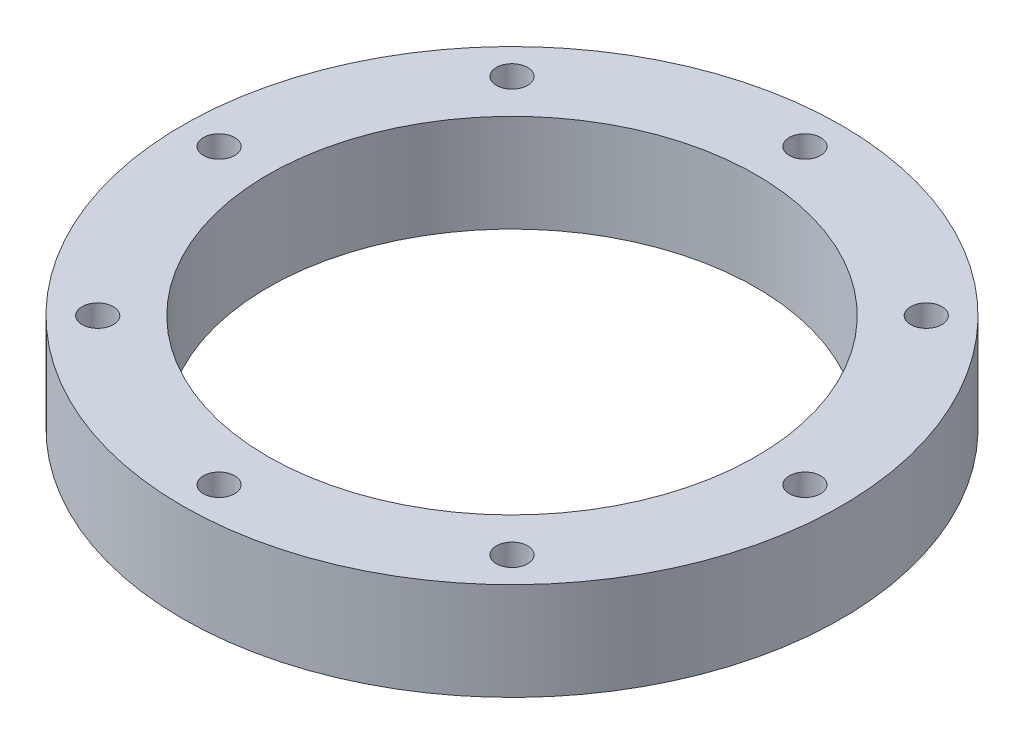
ISO-10303-21;
HEADER;
FILE_DESCRIPTION(('STEP AP214'),'2;1');
FILE_NAME('part.step','',(''),(''),'','','');
FILE_SCHEMA(('AUTOMOTIVE_DESIGN { 1 0 10303 214 1 1 1 1 }'));
ENDSEC;
DATA;
#1=APPLICATION_CONTEXT('core data for automotive mechanical design processes');
#2=APPLICATION_PROTOCOL_DEFINITION('international standard','automotive_design',2000,#1);
#3=PRODUCT_CONTEXT('',#1,'mechanical');
#4=PRODUCT('Part','Part','',(#3));
#5=PRODUCT_RELATED_PRODUCT_CATEGORY('part','',(#4));
#6=PRODUCT_DEFINITION_FORMATION('','',#4);
#7=PRODUCT_DEFINITION_CONTEXT('part definition',#1,'design');
#8=PRODUCT_DEFINITION('design','',#6,#7);
#9=PRODUCT_DEFINITION_SHAPE('','',#8);
#10=(LENGTH_UNIT() NAMED_UNIT(*) SI_UNIT(.MILLI.,.METRE.));
#11=(NAMED_UNIT(*) PLANE_ANGLE_UNIT() SI_UNIT($,.RADIAN.));
#12=(NAMED_UNIT(*) SI_UNIT($,.STERADIAN.) SOLID_ANGLE_UNIT());
#13=UNCERTAINTY_MEASURE_WITH_UNIT(LENGTH_MEASURE(1.E-05),#10,'distance_accuracy_value','');
#14=(GEOMETRIC_REPRESENTATION_CONTEXT(3) GLOBAL_UNCERTAINTY_ASSIGNED_CONTEXT((#13)) GLOBAL_UNIT_ASSIGNED_CONTEXT((#10,
#11,#12)) REPRESENTATION_CONTEXT('',''));
#15=CARTESIAN_POINT('',(0.,0.,0.));
#16=DIRECTION('',(0.,0.,1.));
#17=DIRECTION('',(1.,0.,0.));
#18=AXIS2_PLACEMENT_3D('',#15,#16,#17);
#19=CARTESIAN_POINT('',(0.,20.,0.));
#20=DIRECTION('',(0.,1.,0.));
#21=DIRECTION('',(0.,0.,1.));
#22=AXIS2_PLACEMENT_3D('',#19,#20,#21);
#23=PLANE('',#22);
#24=CARTESIAN_POINT('',(0.,20.,-60.));
#25=DIRECTION('',(0.,1.,0.));
#26=DIRECTION('',(0.,0.,1.));
#27=AXIS2_PLACEMENT_3D('',#24,#25,#26);
#28=CIRCLE('',#27,3.2);
#29=CARTESIAN_POINT('',(0.,20.,-56.8));
#30=VERTEX_POINT('',#29);
#31=EDGE_CURVE('E104',#30,#30,#28,.T.);
#32=ORIENTED_EDGE('',*,*,#31,.F.);
#33=EDGE_LOOP('',(#32));
#34=FACE_BOUND('',#33,.T.);
#35=CARTESIAN_POINT('',(42.4264068711928,20.,-42.4264068711929));
#36=DIRECTION('',(0.,1.,0.));
#37=DIRECTION('',(0.,0.,1.));
#38=AXIS2_PLACEMENT_3D('',#35,#36,#37);
#39=CIRCLE('',#38,3.2);
#40=CARTESIAN_POINT('',(42.4264068711928,20.,-39.2264068711929));
#41=VERTEX_POINT('',#40);
#42=EDGE_CURVE('E98',#41,#41,#39,.T.);
#43=ORIENTED_EDGE('',*,*,#42,.F.);
#44=EDGE_LOOP('',(#43));
#45=FACE_BOUND('',#44,.T.);
#46=CARTESIAN_POINT('',(60.,20.,0.));
#47=DIRECTION('',(0.,1.,0.));
#48=DIRECTION('',(0.,0.,1.));
#49=AXIS2_PLACEMENT_3D('',#46,#47,#48);
#50=CIRCLE('',#49,3.20000000000001);
#51=CARTESIAN_POINT('',(60.,20.,3.20000000000001));
#52=VERTEX_POINT('',#51);
#53=EDGE_CURVE('E92',#52,#52,#50,.T.);
#54=ORIENTED_EDGE('',*,*,#53,.F.);
#55=EDGE_LOOP('',(#54));
#56=FACE_BOUND('',#55,.T.);
#57=CARTESIAN_POINT('',(42.4264068711929,20.,42.4264068711928));
#58=DIRECTION('',(0.,1.,0.));
#59=DIRECTION('',(0.,0.,1.));
#60=AXIS2_PLACEMENT_3D('',#57,#58,#59);
#61=CIRCLE('',#60,3.2);
#62=CARTESIAN_POINT('',(42.4264068711929,20.,45.6264068711928));
#63=VERTEX_POINT('',#62);
#64=EDGE_CURVE('E86',#63,#63,#61,.T.);
#65=ORIENTED_EDGE('',*,*,#64,.F.);
#66=EDGE_LOOP('',(#65));
#67=FACE_BOUND('',#66,.T.);
#68=CARTESIAN_POINT('',(0.,20.,60.));
#69=DIRECTION('',(0.,1.,0.));
#70=DIRECTION('',(0.,0.,1.));
#71=AXIS2_PLACEMENT_3D('',#68,#69,#70);
#72=CIRCLE('',#71,3.2);
#73=CARTESIAN_POINT('',(0.,20.,63.2));
#74=VERTEX_POINT('',#73);
#75=EDGE_CURVE('E80',#74,#74,#72,.T.);
#76=ORIENTED_EDGE('',*,*,#75,.F.);
#77=EDGE_LOOP('',(#76));
#78=FACE_BOUND('',#77,.T.);
#79=CARTESIAN_POINT('',(-42.4264068711928,20.,42.4264068711929));
#80=DIRECTION('',(0.,1.,0.));
#81=DIRECTION('',(0.,0.,1.));
#82=AXIS2_PLACEMENT_3D('',#79,#80,#81);
#83=CIRCLE('',#82,3.2);
#84=CARTESIAN_POINT('',(-42.4264068711928,20.,45.6264068711929));
#85=VERTEX_POINT('',#84);
#86=EDGE_CURVE('E74',#85,#85,#83,.T.);
#87=ORIENTED_EDGE('',*,*,#86,.F.);
#88=EDGE_LOOP('',(#87));
#89=FACE_BOUND('',#88,.T.);
#90=CARTESIAN_POINT('',(-60.,20.,0.));
#91=DIRECTION('',(0.,1.,0.));
#92=DIRECTION('',(0.,0.,1.));
#93=AXIS2_PLACEMENT_3D('',#90,#91,#92);
#94=CIRCLE('',#93,3.2);
#95=CARTESIAN_POINT('',(-60.,20.,3.20000000000001));
#96=VERTEX_POINT('',#95);
#97=EDGE_CURVE('E68',#96,#96,#94,.T.);
#98=ORIENTED_EDGE('',*,*,#97,.F.);
#99=EDGE_LOOP('',(#98));
#100=FACE_BOUND('',#99,.T.);
#101=CARTESIAN_POINT('',(-42.4264068711929,20.,-42.4264068711928));
#102=DIRECTION('',(0.,1.,0.));
#103=DIRECTION('',(0.,0.,1.));
#104=AXIS2_PLACEMENT_3D('',#101,#102,#103);
#105=CIRCLE('',#104,3.2);
#106=CARTESIAN_POINT('',(-42.4264068711929,20.,-39.2264068711928));
#107=VERTEX_POINT('',#106);
#108=EDGE_CURVE('E62',#107,#107,#105,.T.);
#109=ORIENTED_EDGE('',*,*,#108,.F.);
#110=EDGE_LOOP('',(#109));
#111=FACE_BOUND('',#110,.T.);
#112=CARTESIAN_POINT('',(0.,20.,0.));
#113=DIRECTION('',(0.,1.,0.));
#114=DIRECTION('',(0.,0.,1.));
#115=AXIS2_PLACEMENT_3D('',#112,#113,#114);
#116=CIRCLE('',#115,67.5);
#117=CARTESIAN_POINT('',(0.,20.,67.5));
#118=VERTEX_POINT('',#117);
#119=EDGE_CURVE('E10',#118,#118,#116,.T.);
#120=ORIENTED_EDGE('',*,*,#119,.T.);
#121=EDGE_LOOP('',(#120));
#122=FACE_BOUND('',#121,.T.);
#123=CARTESIAN_POINT('',(0.,20.,0.));
#124=DIRECTION('',(0.,1.,0.));
#125=DIRECTION('',(0.,0.,1.));
#126=AXIS2_PLACEMENT_3D('',#123,#124,#125);
#127=CIRCLE('',#126,50.);
#128=CARTESIAN_POINT('',(0.,20.,50.));
#129=VERTEX_POINT('',#128);
#130=EDGE_CURVE('E54',#129,#129,#127,.T.);
#131=ORIENTED_EDGE('',*,*,#130,.F.);
#132=EDGE_LOOP('',(#131));
#133=FACE_BOUND('',#132,.T.);
#134=ADVANCED_FACE('F43',(#34,#45,#56,#67,#78,#89,#100,#111,#122,#133),#23,.T.);
#135=CARTESIAN_POINT('',(0.,0.,0.));
#136=DIRECTION('',(0.,1.,0.));
#137=DIRECTION('',(0.,0.,1.));
#138=AXIS2_PLACEMENT_3D('',#135,#136,#137);
#139=PLANE('',#138);
#140=CARTESIAN_POINT('',(0.,0.,-60.));
#141=DIRECTION('',(0.,1.,0.));
#142=DIRECTION('',(0.,0.,1.));
#143=AXIS2_PLACEMENT_3D('',#140,#141,#142);
#144=CIRCLE('',#143,3.2);
#145=CARTESIAN_POINT('',(0.,0.,-56.8));
#146=VERTEX_POINT('',#145);
#147=EDGE_CURVE('E59',#146,#146,#144,.T.);
#148=ORIENTED_EDGE('',*,*,#147,.T.);
#149=EDGE_LOOP('',(#148));
#150=FACE_BOUND('',#149,.T.);
#151=CARTESIAN_POINT('',(42.4264068711928,0.,-42.4264068711929));
#152=DIRECTION('',(0.,1.,0.));
#153=DIRECTION('',(0.,0.,1.));
#154=AXIS2_PLACEMENT_3D('',#151,#152,#153);
#155=CIRCLE('',#154,3.2);
#156=CARTESIAN_POINT('',(42.4264068711928,0.,-39.2264068711929));
#157=VERTEX_POINT('',#156);
#158=EDGE_CURVE('E101',#157,#157,#155,.T.);
#159=ORIENTED_EDGE('',*,*,#158,.T.);
#160=EDGE_LOOP('',(#159));
#161=FACE_BOUND('',#160,.T.);
#162=CARTESIAN_POINT('',(60.,0.,0.));
#163=DIRECTION('',(0.,1.,0.));
#164=DIRECTION('',(0.,0.,1.));
#165=AXIS2_PLACEMENT_3D('',#162,#163,#164);
#166=CIRCLE('',#165,3.20000000000001);
#167=CARTESIAN_POINT('',(60.,0.,3.20000000000001));
#168=VERTEX_POINT('',#167);
#169=EDGE_CURVE('E95',#168,#168,#166,.T.);
#170=ORIENTED_EDGE('',*,*,#169,.T.);
#171=EDGE_LOOP('',(#170));
#172=FACE_BOUND('',#171,.T.);
#173=CARTESIAN_POINT('',(42.4264068711929,0.,42.4264068711928));
#174=DIRECTION('',(0.,1.,0.));
#175=DIRECTION('',(0.,0.,1.));
#176=AXIS2_PLACEMENT_3D('',#173,#174,#175);
#177=CIRCLE('',#176,3.2);
#178=CARTESIAN_POINT('',(42.4264068711929,0.,45.6264068711928));
#179=VERTEX_POINT('',#178);
#180=EDGE_CURVE('E89',#179,#179,#177,.T.);
#181=ORIENTED_EDGE('',*,*,#180,.T.);
#182=EDGE_LOOP('',(#181));
#183=FACE_BOUND('',#182,.T.);
#184=CARTESIAN_POINT('',(0.,0.,60.));
#185=DIRECTION('',(0.,1.,0.));
#186=DIRECTION('',(0.,0.,1.));
#187=AXIS2_PLACEMENT_3D('',#184,#185,#186);
#188=CIRCLE('',#187,3.2);
#189=CARTESIAN_POINT('',(0.,0.,63.2));
#190=VERTEX_POINT('',#189);
#191=EDGE_CURVE('E83',#190,#190,#188,.T.);
#192=ORIENTED_EDGE('',*,*,#191,.T.);
#193=EDGE_LOOP('',(#192));
#194=FACE_BOUND('',#193,.T.);
#195=CARTESIAN_POINT('',(-42.4264068711928,0.,42.4264068711929));
#196=DIRECTION('',(0.,1.,0.));
#197=DIRECTION('',(0.,0.,1.));
#198=AXIS2_PLACEMENT_3D('',#195,#196,#197);
#199=CIRCLE('',#198,3.2);
#200=CARTESIAN_POINT('',(-42.4264068711928,0.,45.6264068711929));
#201=VERTEX_POINT('',#200);
#202=EDGE_CURVE('E77',#201,#201,#199,.T.);
#203=ORIENTED_EDGE('',*,*,#202,.T.);
#204=EDGE_LOOP('',(#203));
#205=FACE_BOUND('',#204,.T.);
#206=CARTESIAN_POINT('',(-60.,0.,0.));
#207=DIRECTION('',(0.,1.,0.));
#208=DIRECTION('',(0.,0.,1.));
#209=AXIS2_PLACEMENT_3D('',#206,#207,#208);
#210=CIRCLE('',#209,3.2);
#211=CARTESIAN_POINT('',(-60.,0.,3.20000000000001));
#212=VERTEX_POINT('',#211);
#213=EDGE_CURVE('E71',#212,#212,#210,.T.);
#214=ORIENTED_EDGE('',*,*,#213,.T.);
#215=EDGE_LOOP('',(#214));
#216=FACE_BOUND('',#215,.T.);
#217=CARTESIAN_POINT('',(-42.4264068711929,0.,-42.4264068711928));
#218=DIRECTION('',(0.,1.,0.));
#219=DIRECTION('',(0.,0.,1.));
#220=AXIS2_PLACEMENT_3D('',#217,#218,#219);
#221=CIRCLE('',#220,3.2);
#222=CARTESIAN_POINT('',(-42.4264068711929,0.,-39.2264068711928));
#223=VERTEX_POINT('',#222);
#224=EDGE_CURVE('E65',#223,#223,#221,.T.);
#225=ORIENTED_EDGE('',*,*,#224,.T.);
#226=EDGE_LOOP('',(#225));
#227=FACE_BOUND('',#226,.T.);
#228=CARTESIAN_POINT('',(0.,0.,0.));
#229=DIRECTION('',(0.,1.,0.));
#230=DIRECTION('',(0.,0.,1.));
#231=AXIS2_PLACEMENT_3D('',#228,#229,#230);
#232=CIRCLE('',#231,67.5);
#233=CARTESIAN_POINT('',(0.,0.,67.5));
#234=VERTEX_POINT('',#233);
#235=EDGE_CURVE('E47',#234,#234,#232,.T.);
#236=ORIENTED_EDGE('',*,*,#235,.F.);
#237=EDGE_LOOP('',(#236));
#238=FACE_BOUND('',#237,.T.);
#239=CARTESIAN_POINT('',(0.,0.,0.));
#240=DIRECTION('',(0.,1.,0.));
#241=DIRECTION('',(0.,0.,1.));
#242=AXIS2_PLACEMENT_3D('',#239,#240,#241);
#243=CIRCLE('',#242,50.);
#244=CARTESIAN_POINT('',(0.,0.,50.));
#245=VERTEX_POINT('',#244);
#246=EDGE_CURVE('E56',#245,#245,#243,.T.);
#247=ORIENTED_EDGE('',*,*,#246,.T.);
#248=EDGE_LOOP('',(#247));
#249=FACE_BOUND('',#248,.T.);
#250=ADVANCED_FACE('F110',(#150,#161,#172,#183,#194,#205,#216,#227,#238,#249),#139,.F.);
#251=CARTESIAN_POINT('',(0.,20.,0.));
#252=DIRECTION('',(0.,-1.,0.));
#253=DIRECTION('',(0.,0.,-1.));
#254=AXIS2_PLACEMENT_3D('',#251,#252,#253);
#255=CYLINDRICAL_SURFACE('',#254,67.5);
#256=ORIENTED_EDGE('',*,*,#119,.F.);
#257=EDGE_LOOP('',(#256));
#258=FACE_BOUND('',#257,.T.);
#259=ORIENTED_EDGE('',*,*,#235,.T.);
#260=EDGE_LOOP('',(#259));
#261=FACE_BOUND('',#260,.T.);
#262=ADVANCED_FACE('F45',(#258,#261),#255,.T.);
#263=CARTESIAN_POINT('',(0.,20.,0.));
#264=DIRECTION('',(0.,-1.,0.));
#265=DIRECTION('',(0.,0.,-1.));
#266=AXIS2_PLACEMENT_3D('',#263,#264,#265);
#267=CYLINDRICAL_SURFACE('',#266,50.);
#268=ORIENTED_EDGE('',*,*,#130,.T.);
#269=EDGE_LOOP('',(#268));
#270=FACE_BOUND('',#269,.T.);
#271=ORIENTED_EDGE('',*,*,#246,.F.);
#272=EDGE_LOOP('',(#271));
#273=FACE_BOUND('',#272,.T.);
#274=ADVANCED_FACE('F139',(#270,#273),#267,.F.);
#275=CARTESIAN_POINT('',(-42.4264068711929,0.,-42.4264068711928));
#276=DIRECTION('',(0.,1.,0.));
#277=DIRECTION('',(0.,0.,1.));
#278=AXIS2_PLACEMENT_3D('',#275,#276,#277);
#279=CYLINDRICAL_SURFACE('',#278,3.2);
#280=ORIENTED_EDGE('',*,*,#224,.F.);
#281=EDGE_LOOP('',(#280));
#282=FACE_BOUND('',#281,.T.);
#283=ORIENTED_EDGE('',*,*,#108,.T.);
#284=EDGE_LOOP('',(#283));
#285=FACE_BOUND('',#284,.T.);
#286=ADVANCED_FACE('F142',(#282,#285),#279,.F.);
#287=CARTESIAN_POINT('',(-60.,0.,0.));
#288=DIRECTION('',(0.,1.,0.));
#289=DIRECTION('',(0.,0.,1.));
#290=AXIS2_PLACEMENT_3D('',#287,#288,#289);
#291=CYLINDRICAL_SURFACE('',#290,3.2);
#292=ORIENTED_EDGE('',*,*,#213,.F.);
#293=EDGE_LOOP('',(#292));
#294=FACE_BOUND('',#293,.T.);
#295=ORIENTED_EDGE('',*,*,#97,.T.);
#296=EDGE_LOOP('',(#295));
#297=FACE_BOUND('',#296,.T.);
#298=ADVANCED_FACE('F155',(#294,#297),#291,.F.);
#299=CARTESIAN_POINT('',(-42.4264068711928,0.,42.4264068711929));
#300=DIRECTION('',(0.,1.,0.));
#301=DIRECTION('',(0.,0.,1.));
#302=AXIS2_PLACEMENT_3D('',#299,#300,#301);
#303=CYLINDRICAL_SURFACE('',#302,3.2);
#304=ORIENTED_EDGE('',*,*,#202,.F.);
#305=EDGE_LOOP('',(#304));
#306=FACE_BOUND('',#305,.T.);
#307=ORIENTED_EDGE('',*,*,#86,.T.);
#308=EDGE_LOOP('',(#307));
#309=FACE_BOUND('',#308,.T.);
#310=ADVANCED_FACE('F159',(#306,#309),#303,.F.);
#311=CARTESIAN_POINT('',(0.,0.,60.));
#312=DIRECTION('',(0.,1.,0.));
#313=DIRECTION('',(0.,0.,1.));
#314=AXIS2_PLACEMENT_3D('',#311,#312,#313);
#315=CYLINDRICAL_SURFACE('',#314,3.2);
#316=ORIENTED_EDGE('',*,*,#191,.F.);
#317=EDGE_LOOP('',(#316));
#318=FACE_BOUND('',#317,.T.);
#319=ORIENTED_EDGE('',*,*,#75,.T.);
#320=EDGE_LOOP('',(#319));
#321=FACE_BOUND('',#320,.T.);
#322=ADVANCED_FACE('F163',(#318,#321),#315,.F.);
#323=CARTESIAN_POINT('',(42.4264068711929,0.,42.4264068711928));
#324=DIRECTION('',(0.,1.,0.));
#325=DIRECTION('',(0.,0.,1.));
#326=AXIS2_PLACEMENT_3D('',#323,#324,#325);
#327=CYLINDRICAL_SURFACE('',#326,3.2);
#328=ORIENTED_EDGE('',*,*,#180,.F.);
#329=EDGE_LOOP('',(#328));
#330=FACE_BOUND('',#329,.T.);
#331=ORIENTED_EDGE('',*,*,#64,.T.);
#332=EDGE_LOOP('',(#331));
#333=FACE_BOUND('',#332,.T.);
#334=ADVANCED_FACE('F167',(#330,#333),#327,.F.);
#335=CARTESIAN_POINT('',(60.,0.,0.));
#336=DIRECTION('',(0.,1.,0.));
#337=DIRECTION('',(0.,0.,1.));
#338=AXIS2_PLACEMENT_3D('',#335,#336,#337);
#339=CYLINDRICAL_SURFACE('',#338,3.20000000000001);
#340=ORIENTED_EDGE('',*,*,#169,.F.);
#341=EDGE_LOOP('',(#340));
#342=FACE_BOUND('',#341,.T.);
#343=ORIENTED_EDGE('',*,*,#53,.T.);
#344=EDGE_LOOP('',(#343));
#345=FACE_BOUND('',#344,.T.);
#346=ADVANCED_FACE('F171',(#342,#345),#339,.F.);
#347=CARTESIAN_POINT('',(42.4264068711928,0.,-42.4264068711929));
#348=DIRECTION('',(0.,1.,0.));
#349=DIRECTION('',(0.,0.,1.));
#350=AXIS2_PLACEMENT_3D('',#347,#348,#349);
#351=CYLINDRICAL_SURFACE('',#350,3.2);
#352=ORIENTED_EDGE('',*,*,#158,.F.);
#353=EDGE_LOOP('',(#352));
#354=FACE_BOUND('',#353,.T.);
#355=ORIENTED_EDGE('',*,*,#42,.T.);
#356=EDGE_LOOP('',(#355));
#357=FACE_BOUND('',#356,.T.);
#358=ADVANCED_FACE('F116',(#354,#357),#351,.F.);
#359=CARTESIAN_POINT('',(0.,0.,-60.));
#360=DIRECTION('',(0.,1.,0.));
#361=DIRECTION('',(0.,0.,1.));
#362=AXIS2_PLACEMENT_3D('',#359,#360,#361);
#363=CYLINDRICAL_SURFACE('',#362,3.2);
#364=ORIENTED_EDGE('',*,*,#147,.F.);
#365=EDGE_LOOP('',(#364));
#366=FACE_BOUND('',#365,.T.);
#367=ORIENTED_EDGE('',*,*,#31,.T.);
#368=EDGE_LOOP('',(#367));
#369=FACE_BOUND('',#368,.T.);
#370=ADVANCED_FACE('F113',(#366,#369),#363,.F.);
#371=CLOSED_SHELL('',(#134,#250,#262,#274,#286,#298,#310,#322,#334,#346,#358,#370));
#372=MANIFOLD_SOLID_BREP('B2',#371);
#373=ADVANCED_BREP_SHAPE_REPRESENTATION('',(#18,#372),#14);
#374=SHAPE_DEFINITION_REPRESENTATION(#9,#373);
ENDSEC;
END-ISO-10303-21;
